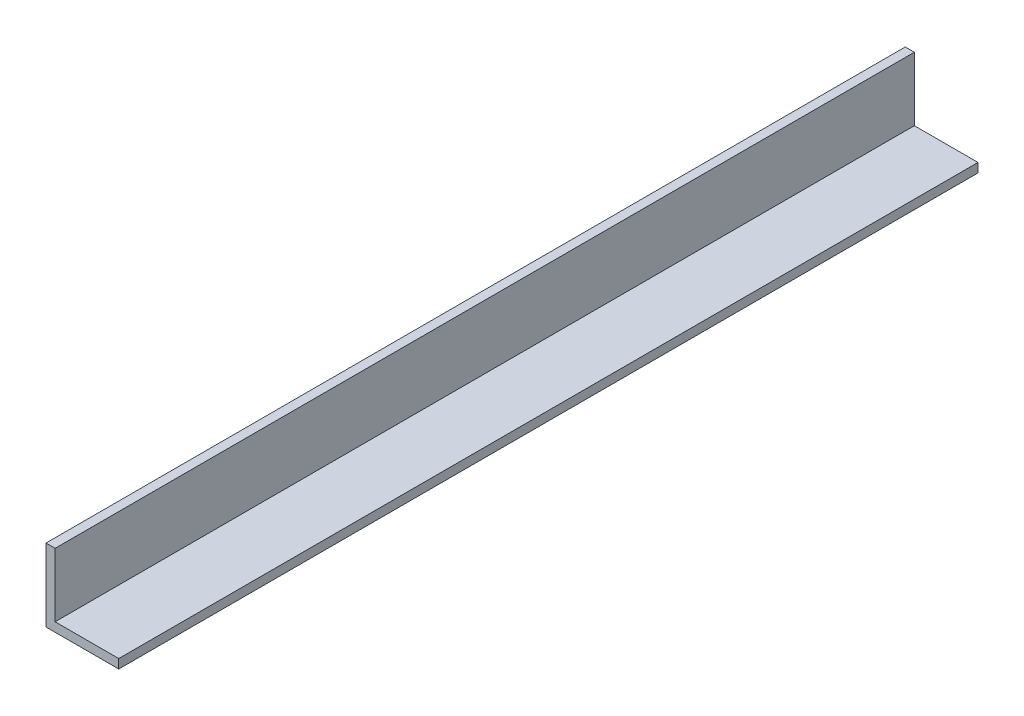
ISO-10303-21;
HEADER;
FILE_DESCRIPTION(('STEP AP214'),'2;1');
FILE_NAME('part.step','',(''),(''),'','','');
FILE_SCHEMA(('AUTOMOTIVE_DESIGN { 1 0 10303 214 1 1 1 1 }'));
ENDSEC;
DATA;
#1=APPLICATION_CONTEXT('core data for automotive mechanical design processes');
#2=APPLICATION_PROTOCOL_DEFINITION('international standard','automotive_design',2000,#1);
#3=PRODUCT_CONTEXT('',#1,'mechanical');
#4=PRODUCT('Part','Part','',(#3));
#5=PRODUCT_RELATED_PRODUCT_CATEGORY('part','',(#4));
#6=PRODUCT_DEFINITION_FORMATION('','',#4);
#7=PRODUCT_DEFINITION_CONTEXT('part definition',#1,'design');
#8=PRODUCT_DEFINITION('design','',#6,#7);
#9=PRODUCT_DEFINITION_SHAPE('','',#8);
#10=(LENGTH_UNIT() NAMED_UNIT(*) SI_UNIT(.MILLI.,.METRE.));
#11=(NAMED_UNIT(*) PLANE_ANGLE_UNIT() SI_UNIT($,.RADIAN.));
#12=(NAMED_UNIT(*) SI_UNIT($,.STERADIAN.) SOLID_ANGLE_UNIT());
#13=UNCERTAINTY_MEASURE_WITH_UNIT(LENGTH_MEASURE(1.E-05),#10,'distance_accuracy_value','');
#14=(GEOMETRIC_REPRESENTATION_CONTEXT(3) GLOBAL_UNCERTAINTY_ASSIGNED_CONTEXT((#13)) GLOBAL_UNIT_ASSIGNED_CONTEXT((#10,
#11,#12)) REPRESENTATION_CONTEXT('',''));
#15=CARTESIAN_POINT('',(0.,0.,0.));
#16=DIRECTION('',(0.,0.,1.));
#17=DIRECTION('',(1.,0.,0.));
#18=AXIS2_PLACEMENT_3D('',#15,#16,#17);
#19=CARTESIAN_POINT('',(0.,25.4,300.));
#20=DIRECTION('',(1.,0.,0.));
#21=DIRECTION('',(0.,1.,0.));
#22=AXIS2_PLACEMENT_3D('',#19,#20,#21);
#23=PLANE('',#22);
#24=DIRECTION('',(0.,-1.,0.));
#25=VECTOR('',#24,1.);
#26=CARTESIAN_POINT('',(0.,25.4,0.));
#27=LINE('',#26,#25);
#28=CARTESIAN_POINT('',(0.,25.4,0.));
#29=VERTEX_POINT('',#28);
#30=CARTESIAN_POINT('',(0.,0.,0.));
#31=VERTEX_POINT('',#30);
#32=EDGE_CURVE('E118',#29,#31,#27,.T.);
#33=ORIENTED_EDGE('',*,*,#32,.T.);
#34=DIRECTION('',(0.,0.,-1.));
#35=VECTOR('',#34,1.);
#36=CARTESIAN_POINT('',(0.,0.,300.));
#37=LINE('',#36,#35);
#38=CARTESIAN_POINT('',(0.,0.,300.));
#39=VERTEX_POINT('',#38);
#40=EDGE_CURVE('E11',#39,#31,#37,.T.);
#41=ORIENTED_EDGE('',*,*,#40,.F.);
#42=DIRECTION('',(0.,-1.,0.));
#43=VECTOR('',#42,1.);
#44=CARTESIAN_POINT('',(0.,25.4,300.));
#45=LINE('',#44,#43);
#46=CARTESIAN_POINT('',(0.,25.4,300.));
#47=VERTEX_POINT('',#46);
#48=EDGE_CURVE('E128',#47,#39,#45,.T.);
#49=ORIENTED_EDGE('',*,*,#48,.F.);
#50=DIRECTION('',(0.,0.,-1.));
#51=VECTOR('',#50,1.);
#52=CARTESIAN_POINT('',(0.,25.4,300.));
#53=LINE('',#52,#51);
#54=EDGE_CURVE('E114',#47,#29,#53,.T.);
#55=ORIENTED_EDGE('',*,*,#54,.T.);
#56=EDGE_LOOP('',(#33,#41,#49,#55));
#57=FACE_BOUND('',#56,.T.);
#58=ADVANCED_FACE('F34',(#57),#23,.F.);
#59=CARTESIAN_POINT('',(0.,0.,300.));
#60=DIRECTION('',(0.,1.,0.));
#61=DIRECTION('',(0.,0.,1.));
#62=AXIS2_PLACEMENT_3D('',#59,#60,#61);
#63=PLANE('',#62);
#64=DIRECTION('',(1.,0.,0.));
#65=VECTOR('',#64,1.);
#66=CARTESIAN_POINT('',(0.,0.,0.));
#67=LINE('',#66,#65);
#68=CARTESIAN_POINT('',(25.4,0.,0.));
#69=VERTEX_POINT('',#68);
#70=EDGE_CURVE('E121',#31,#69,#67,.T.);
#71=ORIENTED_EDGE('',*,*,#70,.T.);
#72=DIRECTION('',(0.,0.,-1.));
#73=VECTOR('',#72,1.);
#74=CARTESIAN_POINT('',(25.4,0.,300.));
#75=LINE('',#74,#73);
#76=CARTESIAN_POINT('',(25.4,0.,300.));
#77=VERTEX_POINT('',#76);
#78=EDGE_CURVE('E42',#77,#69,#75,.T.);
#79=ORIENTED_EDGE('',*,*,#78,.F.);
#80=DIRECTION('',(1.,0.,0.));
#81=VECTOR('',#80,1.);
#82=CARTESIAN_POINT('',(0.,0.,300.));
#83=LINE('',#82,#81);
#84=EDGE_CURVE('E87',#39,#77,#83,.T.);
#85=ORIENTED_EDGE('',*,*,#84,.F.);
#86=ORIENTED_EDGE('',*,*,#40,.T.);
#87=EDGE_LOOP('',(#71,#79,#85,#86));
#88=FACE_BOUND('',#87,.T.);
#89=ADVANCED_FACE('F152',(#88),#63,.F.);
#90=CARTESIAN_POINT('',(25.4,0.,300.));
#91=DIRECTION('',(-1.,0.,0.));
#92=DIRECTION('',(0.,0.,1.));
#93=AXIS2_PLACEMENT_3D('',#90,#91,#92);
#94=PLANE('',#93);
#95=DIRECTION('',(0.,1.,0.));
#96=VECTOR('',#95,1.);
#97=CARTESIAN_POINT('',(25.4,0.,0.));
#98=LINE('',#97,#96);
#99=CARTESIAN_POINT('',(25.4,3.18,0.));
#100=VERTEX_POINT('',#99);
#101=EDGE_CURVE('E123',#69,#100,#98,.T.);
#102=ORIENTED_EDGE('',*,*,#101,.T.);
#103=DIRECTION('',(0.,0.,-1.));
#104=VECTOR('',#103,1.);
#105=CARTESIAN_POINT('',(25.4,3.18,300.));
#106=LINE('',#105,#104);
#107=CARTESIAN_POINT('',(25.4,3.18,300.));
#108=VERTEX_POINT('',#107);
#109=EDGE_CURVE('E109',#108,#100,#106,.T.);
#110=ORIENTED_EDGE('',*,*,#109,.F.);
#111=DIRECTION('',(0.,1.,0.));
#112=VECTOR('',#111,1.);
#113=CARTESIAN_POINT('',(25.4,0.,300.));
#114=LINE('',#113,#112);
#115=EDGE_CURVE('E100',#77,#108,#114,.T.);
#116=ORIENTED_EDGE('',*,*,#115,.F.);
#117=ORIENTED_EDGE('',*,*,#78,.T.);
#118=EDGE_LOOP('',(#102,#110,#116,#117));
#119=FACE_BOUND('',#118,.T.);
#120=ADVANCED_FACE('F134',(#119),#94,.F.);
#121=CARTESIAN_POINT('',(25.4,3.18,300.));
#122=DIRECTION('',(0.,-1.,0.));
#123=DIRECTION('',(1.,0.,0.));
#124=AXIS2_PLACEMENT_3D('',#121,#122,#123);
#125=PLANE('',#124);
#126=DIRECTION('',(-1.,0.,0.));
#127=VECTOR('',#126,1.);
#128=CARTESIAN_POINT('',(25.4,3.18,0.));
#129=LINE('',#128,#127);
#130=CARTESIAN_POINT('',(3.18,3.18,0.));
#131=VERTEX_POINT('',#130);
#132=EDGE_CURVE('E108',#100,#131,#129,.T.);
#133=ORIENTED_EDGE('',*,*,#132,.T.);
#134=DIRECTION('',(0.,0.,-1.));
#135=VECTOR('',#134,1.);
#136=CARTESIAN_POINT('',(3.18,3.18,300.));
#137=LINE('',#136,#135);
#138=CARTESIAN_POINT('',(3.18,3.18,300.));
#139=VERTEX_POINT('',#138);
#140=EDGE_CURVE('E105',#139,#131,#137,.T.);
#141=ORIENTED_EDGE('',*,*,#140,.F.);
#142=DIRECTION('',(-1.,0.,0.));
#143=VECTOR('',#142,1.);
#144=CARTESIAN_POINT('',(25.4,3.18,300.));
#145=LINE('',#144,#143);
#146=EDGE_CURVE('E94',#108,#139,#145,.T.);
#147=ORIENTED_EDGE('',*,*,#146,.F.);
#148=ORIENTED_EDGE('',*,*,#109,.T.);
#149=EDGE_LOOP('',(#133,#141,#147,#148));
#150=FACE_BOUND('',#149,.T.);
#151=ADVANCED_FACE('F106',(#150),#125,.F.);
#152=CARTESIAN_POINT('',(3.18,3.18,300.));
#153=DIRECTION('',(-1.,0.,0.));
#154=DIRECTION('',(0.,-1.,0.));
#155=AXIS2_PLACEMENT_3D('',#152,#153,#154);
#156=PLANE('',#155);
#157=DIRECTION('',(0.,1.,0.));
#158=VECTOR('',#157,1.);
#159=CARTESIAN_POINT('',(3.18,3.18,0.));
#160=LINE('',#159,#158);
#161=CARTESIAN_POINT('',(3.18,25.4,0.));
#162=VERTEX_POINT('',#161);
#163=EDGE_CURVE('E73',#131,#162,#160,.T.);
#164=ORIENTED_EDGE('',*,*,#163,.T.);
#165=DIRECTION('',(0.,0.,-1.));
#166=VECTOR('',#165,1.);
#167=CARTESIAN_POINT('',(3.18,25.4,300.));
#168=LINE('',#167,#166);
#169=CARTESIAN_POINT('',(3.18,25.4,300.));
#170=VERTEX_POINT('',#169);
#171=EDGE_CURVE('E110',#170,#162,#168,.T.);
#172=ORIENTED_EDGE('',*,*,#171,.F.);
#173=DIRECTION('',(0.,1.,0.));
#174=VECTOR('',#173,1.);
#175=CARTESIAN_POINT('',(3.18,3.18,300.));
#176=LINE('',#175,#174);
#177=EDGE_CURVE('E98',#139,#170,#176,.T.);
#178=ORIENTED_EDGE('',*,*,#177,.F.);
#179=ORIENTED_EDGE('',*,*,#140,.T.);
#180=EDGE_LOOP('',(#164,#172,#178,#179));
#181=FACE_BOUND('',#180,.T.);
#182=ADVANCED_FACE('F112',(#181),#156,.F.);
#183=CARTESIAN_POINT('',(3.18,25.4,300.));
#184=DIRECTION('',(0.,-1.,0.));
#185=DIRECTION('',(1.,0.,0.));
#186=AXIS2_PLACEMENT_3D('',#183,#184,#185);
#187=PLANE('',#186);
#188=DIRECTION('',(-1.,0.,0.));
#189=VECTOR('',#188,1.);
#190=CARTESIAN_POINT('',(3.18,25.4,0.));
#191=LINE('',#190,#189);
#192=EDGE_CURVE('E79',#162,#29,#191,.T.);
#193=ORIENTED_EDGE('',*,*,#192,.T.);
#194=ORIENTED_EDGE('',*,*,#54,.F.);
#195=DIRECTION('',(-1.,0.,0.));
#196=VECTOR('',#195,1.);
#197=CARTESIAN_POINT('',(3.18,25.4,300.));
#198=LINE('',#197,#196);
#199=EDGE_CURVE('E50',#170,#47,#198,.T.);
#200=ORIENTED_EDGE('',*,*,#199,.F.);
#201=ORIENTED_EDGE('',*,*,#171,.T.);
#202=EDGE_LOOP('',(#193,#194,#200,#201));
#203=FACE_BOUND('',#202,.T.);
#204=ADVANCED_FACE('F141',(#203),#187,.F.);
#205=CARTESIAN_POINT('',(0.,0.,300.));
#206=DIRECTION('',(0.,0.,1.));
#207=DIRECTION('',(1.,0.,0.));
#208=AXIS2_PLACEMENT_3D('',#205,#206,#207);
#209=PLANE('',#208);
#210=ORIENTED_EDGE('',*,*,#48,.T.);
#211=ORIENTED_EDGE('',*,*,#84,.T.);
#212=ORIENTED_EDGE('',*,*,#115,.T.);
#213=ORIENTED_EDGE('',*,*,#146,.T.);
#214=ORIENTED_EDGE('',*,*,#177,.T.);
#215=ORIENTED_EDGE('',*,*,#199,.T.);
#216=EDGE_LOOP('',(#210,#211,#212,#213,#214,#215));
#217=FACE_BOUND('',#216,.T.);
#218=ADVANCED_FACE('F96',(#217),#209,.T.);
#219=CARTESIAN_POINT('',(0.,0.,0.));
#220=DIRECTION('',(0.,0.,1.));
#221=DIRECTION('',(1.,0.,0.));
#222=AXIS2_PLACEMENT_3D('',#219,#220,#221);
#223=PLANE('',#222);
#224=ORIENTED_EDGE('',*,*,#32,.F.);
#225=ORIENTED_EDGE('',*,*,#192,.F.);
#226=ORIENTED_EDGE('',*,*,#163,.F.);
#227=ORIENTED_EDGE('',*,*,#132,.F.);
#228=ORIENTED_EDGE('',*,*,#101,.F.);
#229=ORIENTED_EDGE('',*,*,#70,.F.);
#230=EDGE_LOOP('',(#224,#225,#226,#227,#228,#229));
#231=FACE_BOUND('',#230,.T.);
#232=ADVANCED_FACE('F137',(#231),#223,.F.);
#233=CLOSED_SHELL('',(#58,#89,#120,#151,#182,#204,#218,#232));
#234=MANIFOLD_SOLID_BREP('B2',#233);
#235=ADVANCED_BREP_SHAPE_REPRESENTATION('',(#18,#234),#14);
#236=SHAPE_DEFINITION_REPRESENTATION(#9,#235);
ENDSEC;
END-ISO-10303-21;
